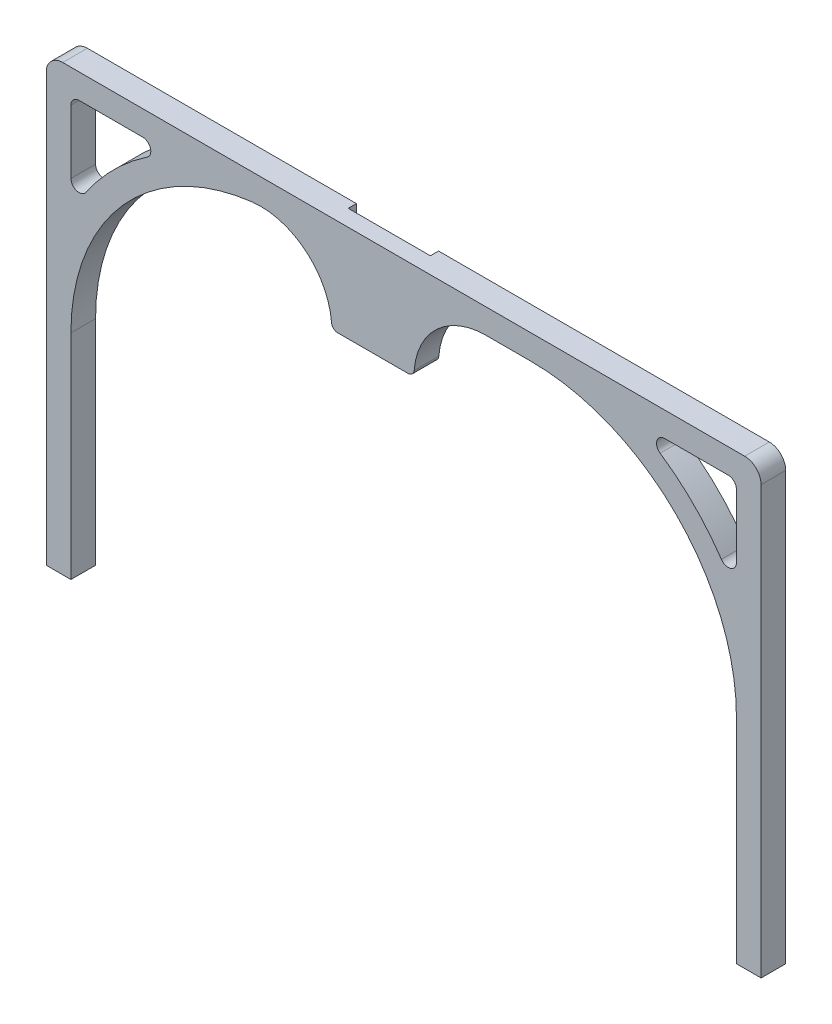
ISO-10303-21;
HEADER;
FILE_DESCRIPTION(('STEP AP214'),'2;1');
FILE_NAME('part.step','',(''),(''),'','','');
FILE_SCHEMA(('AUTOMOTIVE_DESIGN { 1 0 10303 214 1 1 1 1 }'));
ENDSEC;
DATA;
#1=APPLICATION_CONTEXT('core data for automotive mechanical design processes');
#2=APPLICATION_PROTOCOL_DEFINITION('international standard','automotive_design',2000,#1);
#3=PRODUCT_CONTEXT('',#1,'mechanical');
#4=PRODUCT('Part','Part','',(#3));
#5=PRODUCT_RELATED_PRODUCT_CATEGORY('part','',(#4));
#6=PRODUCT_DEFINITION_FORMATION('','',#4);
#7=PRODUCT_DEFINITION_CONTEXT('part definition',#1,'design');
#8=PRODUCT_DEFINITION('design','',#6,#7);
#9=PRODUCT_DEFINITION_SHAPE('','',#8);
#10=(LENGTH_UNIT() NAMED_UNIT(*) SI_UNIT(.MILLI.,.METRE.));
#11=(NAMED_UNIT(*) PLANE_ANGLE_UNIT() SI_UNIT($,.RADIAN.));
#12=(NAMED_UNIT(*) SI_UNIT($,.STERADIAN.) SOLID_ANGLE_UNIT());
#13=UNCERTAINTY_MEASURE_WITH_UNIT(LENGTH_MEASURE(1.E-05),#10,'distance_accuracy_value','');
#14=(GEOMETRIC_REPRESENTATION_CONTEXT(3) GLOBAL_UNCERTAINTY_ASSIGNED_CONTEXT((#13)) GLOBAL_UNIT_ASSIGNED_CONTEXT((#10,
#11,#12)) REPRESENTATION_CONTEXT('',''));
#15=CARTESIAN_POINT('',(0.,0.,0.));
#16=DIRECTION('',(0.,0.,1.));
#17=DIRECTION('',(1.,0.,0.));
#18=AXIS2_PLACEMENT_3D('',#15,#16,#17);
#19=CARTESIAN_POINT('',(-98.425,165.1,19.05));
#20=DIRECTION('',(0.,0.,1.));
#21=DIRECTION('',(-1.,0.,0.));
#22=AXIS2_PLACEMENT_3D('',#19,#20,#21);
#23=CYLINDRICAL_SURFACE('',#22,158.75);
#24=DIRECTION('',(0.,0.,1.));
#25=VECTOR('',#24,1.);
#26=CARTESIAN_POINT('',(-116.873274525354,322.774422995733,-169.772879774976));
#27=LINE('',#26,#25);
#28=CARTESIAN_POINT('',(-116.873274525354,322.774422995733,19.05));
#29=VERTEX_POINT('',#28);
#30=CARTESIAN_POINT('',(-116.873274525354,322.774422995733,38.1));
#31=VERTEX_POINT('',#30);
#32=EDGE_CURVE('E502',#29,#31,#27,.T.);
#33=ORIENTED_EDGE('',*,*,#32,.T.);
#34=CARTESIAN_POINT('',(-98.425,165.1,38.1));
#35=DIRECTION('',(0.,0.,-1.));
#36=DIRECTION('',(1.,0.,0.));
#37=AXIS2_PLACEMENT_3D('',#34,#35,#36);
#38=CIRCLE('',#37,158.75);
#39=CARTESIAN_POINT('',(-257.175,165.1,38.1));
#40=VERTEX_POINT('',#39);
#41=EDGE_CURVE('E441',#40,#31,#38,.T.);
#42=ORIENTED_EDGE('',*,*,#41,.F.);
#43=DIRECTION('',(0.,0.,1.));
#44=VECTOR('',#43,1.);
#45=CARTESIAN_POINT('',(-257.175,165.1,19.05));
#46=LINE('',#45,#44);
#47=CARTESIAN_POINT('',(-257.175,165.1,19.05));
#48=VERTEX_POINT('',#47);
#49=EDGE_CURVE('E457',#48,#40,#46,.T.);
#50=ORIENTED_EDGE('',*,*,#49,.F.);
#51=CARTESIAN_POINT('',(-98.425,165.1,19.05));
#52=DIRECTION('',(0.,0.,-1.));
#53=DIRECTION('',(1.,0.,0.));
#54=AXIS2_PLACEMENT_3D('',#51,#52,#53);
#55=CIRCLE('',#54,158.75);
#56=EDGE_CURVE('E406',#48,#29,#55,.T.);
#57=ORIENTED_EDGE('',*,*,#56,.T.);
#58=EDGE_LOOP('',(#33,#42,#50,#57));
#59=FACE_BOUND('',#58,.T.);
#60=ADVANCED_FACE('F37',(#59),#23,.F.);
#61=CARTESIAN_POINT('',(98.425,165.1,19.05));
#62=DIRECTION('',(0.,0.,1.));
#63=DIRECTION('',(-1.,0.,0.));
#64=AXIS2_PLACEMENT_3D('',#61,#62,#63);
#65=PLANE('',#64);
#66=CARTESIAN_POINT('',(-110.490153680438,268.21892,19.05));
#67=DIRECTION('',(0.,0.,-1.));
#68=DIRECTION('',(-1.,0.,0.));
#69=AXIS2_PLACEMENT_3D('',#66,#67,#68);
#70=CIRCLE('',#69,54.9276536804384);
#71=CARTESIAN_POINT('',(-55.7376130320166,272.6014342762,19.05));
#72=VERTEX_POINT('',#71);
#73=EDGE_CURVE('E497',#29,#72,#70,.T.);
#74=ORIENTED_EDGE('',*,*,#73,.F.);
#75=ORIENTED_EDGE('',*,*,#56,.F.);
#76=DIRECTION('',(0.,1.,0.));
#77=VECTOR('',#76,1.);
#78=CARTESIAN_POINT('',(-257.175,0.,19.05));
#79=LINE('',#78,#77);
#80=CARTESIAN_POINT('',(-257.175,0.,19.05));
#81=VERTEX_POINT('',#80);
#82=EDGE_CURVE('E404',#81,#48,#79,.T.);
#83=ORIENTED_EDGE('',*,*,#82,.F.);
#84=DIRECTION('',(1.,0.,0.));
#85=VECTOR('',#84,1.);
#86=CARTESIAN_POINT('',(-276.225,0.,19.05));
#87=LINE('',#86,#85);
#88=CARTESIAN_POINT('',(-276.225,0.,19.05));
#89=VERTEX_POINT('',#88);
#90=EDGE_CURVE('E401',#89,#81,#87,.T.);
#91=ORIENTED_EDGE('',*,*,#90,.F.);
#92=DIRECTION('',(0.,-1.,0.));
#93=VECTOR('',#92,1.);
#94=CARTESIAN_POINT('',(-276.225,0.,19.05));
#95=LINE('',#94,#93);
#96=CARTESIAN_POINT('',(-276.225,330.2,19.05));
#97=VERTEX_POINT('',#96);
#98=EDGE_CURVE('E398',#97,#89,#95,.T.);
#99=ORIENTED_EDGE('',*,*,#98,.F.);
#100=CARTESIAN_POINT('',(-263.525,330.2,19.05));
#101=DIRECTION('',(0.,0.,1.));
#102=DIRECTION('',(1.,0.,0.));
#103=AXIS2_PLACEMENT_3D('',#100,#101,#102);
#104=CIRCLE('',#103,12.7);
#105=CARTESIAN_POINT('',(-263.525,342.9,19.05));
#106=VERTEX_POINT('',#105);
#107=EDGE_CURVE('E395',#106,#97,#104,.T.);
#108=ORIENTED_EDGE('',*,*,#107,.F.);
#109=DIRECTION('',(-1.,0.,0.));
#110=VECTOR('',#109,1.);
#111=CARTESIAN_POINT('',(263.525,342.9,19.05));
#112=LINE('',#111,#110);
#113=CARTESIAN_POINT('',(-55.5625,342.9,19.05));
#114=VERTEX_POINT('',#113);
#115=EDGE_CURVE('E391',#114,#106,#112,.T.);
#116=ORIENTED_EDGE('',*,*,#115,.F.);
#117=DIRECTION('',(0.,1.,0.));
#118=VECTOR('',#117,1.);
#119=CARTESIAN_POINT('',(-55.5625,0.,19.05));
#120=LINE('',#119,#118);
#121=CARTESIAN_POINT('',(-55.5625,323.85,19.05));
#122=VERTEX_POINT('',#121);
#123=EDGE_CURVE('E279',#122,#114,#120,.T.);
#124=ORIENTED_EDGE('',*,*,#123,.F.);
#125=DIRECTION('',(-1.,0.,0.));
#126=VECTOR('',#125,1.);
#127=CARTESIAN_POINT('',(0.,323.85,19.05));
#128=LINE('',#127,#126);
#129=CARTESIAN_POINT('',(7.93749999999997,323.85,19.0500000000001));
#130=VERTEX_POINT('',#129);
#131=EDGE_CURVE('E500',#130,#122,#128,.T.);
#132=ORIENTED_EDGE('',*,*,#131,.F.);
#133=DIRECTION('',(0.,1.,0.));
#134=VECTOR('',#133,1.);
#135=CARTESIAN_POINT('',(7.9375,0.,19.0500000000001));
#136=LINE('',#135,#134);
#137=CARTESIAN_POINT('',(7.93749999999996,342.9,19.0500000000001));
#138=VERTEX_POINT('',#137);
#139=EDGE_CURVE('E258',#130,#138,#136,.T.);
#140=ORIENTED_EDGE('',*,*,#139,.T.);
#141=CARTESIAN_POINT('',(263.525,342.9,19.05));
#142=VERTEX_POINT('',#141);
#143=EDGE_CURVE('E392',#142,#138,#112,.T.);
#144=ORIENTED_EDGE('',*,*,#143,.F.);
#145=CARTESIAN_POINT('',(263.525,330.2,19.05));
#146=DIRECTION('',(0.,0.,1.));
#147=DIRECTION('',(1.,0.,0.));
#148=AXIS2_PLACEMENT_3D('',#145,#146,#147);
#149=CIRCLE('',#148,12.7);
#150=CARTESIAN_POINT('',(276.225,330.2,19.05));
#151=VERTEX_POINT('',#150);
#152=EDGE_CURVE('E388',#151,#142,#149,.T.);
#153=ORIENTED_EDGE('',*,*,#152,.F.);
#154=DIRECTION('',(0.,1.,0.));
#155=VECTOR('',#154,1.);
#156=CARTESIAN_POINT('',(276.225,0.,19.05));
#157=LINE('',#156,#155);
#158=CARTESIAN_POINT('',(276.225,0.,19.05));
#159=VERTEX_POINT('',#158);
#160=EDGE_CURVE('E384',#159,#151,#157,.T.);
#161=ORIENTED_EDGE('',*,*,#160,.F.);
#162=DIRECTION('',(1.,0.,0.));
#163=VECTOR('',#162,1.);
#164=CARTESIAN_POINT('',(276.225,0.,19.05));
#165=LINE('',#164,#163);
#166=CARTESIAN_POINT('',(257.175,0.,19.05));
#167=VERTEX_POINT('',#166);
#168=EDGE_CURVE('E381',#167,#159,#165,.T.);
#169=ORIENTED_EDGE('',*,*,#168,.F.);
#170=DIRECTION('',(0.,-1.,0.));
#171=VECTOR('',#170,1.);
#172=CARTESIAN_POINT('',(257.175,165.1,19.05));
#173=LINE('',#172,#171);
#174=CARTESIAN_POINT('',(257.175,165.1,19.05));
#175=VERTEX_POINT('',#174);
#176=EDGE_CURVE('E415',#175,#167,#173,.T.);
#177=ORIENTED_EDGE('',*,*,#176,.F.);
#178=CARTESIAN_POINT('',(98.425,165.1,19.05));
#179=DIRECTION('',(0.,0.,-1.));
#180=DIRECTION('',(-1.,0.,0.));
#181=AXIS2_PLACEMENT_3D('',#178,#179,#180);
#182=CIRCLE('',#181,158.75);
#183=CARTESIAN_POINT('',(98.4249999999999,323.85,19.05));
#184=VERTEX_POINT('',#183);
#185=EDGE_CURVE('E412',#184,#175,#182,.T.);
#186=ORIENTED_EDGE('',*,*,#185,.F.);
#187=DIRECTION('',(1.,0.,0.));
#188=VECTOR('',#187,1.);
#189=CARTESIAN_POINT('',(98.4249999999999,323.85,19.05));
#190=LINE('',#189,#188);
#191=CARTESIAN_POINT('',(63.56858,323.85,19.05));
#192=VERTEX_POINT('',#191);
#193=EDGE_CURVE('E409',#192,#184,#190,.T.);
#194=ORIENTED_EDGE('',*,*,#193,.F.);
#195=CARTESIAN_POINT('',(63.56858,268.21892,19.05));
#196=DIRECTION('',(0.,0.,-1.));
#197=DIRECTION('',(-1.,0.,0.));
#198=AXIS2_PLACEMENT_3D('',#195,#196,#197);
#199=CIRCLE('',#198,55.63108);
#200=CARTESIAN_POINT('',(8.11074179442255,272.605860110191,19.05));
#201=VERTEX_POINT('',#200);
#202=EDGE_CURVE('E498',#192,#201,#199,.F.);
#203=ORIENTED_EDGE('',*,*,#202,.T.);
#204=CARTESIAN_POINT('',(3.36307278540703,272.98142,19.05));
#205=DIRECTION('',(0.,0.,-1.));
#206=DIRECTION('',(-1.,0.,0.));
#207=AXIS2_PLACEMENT_3D('',#204,#205,#206);
#208=CIRCLE('',#207,4.7625);
#209=CARTESIAN_POINT('',(3.36307278540703,268.21892,19.05));
#210=VERTEX_POINT('',#209);
#211=EDGE_CURVE('E484',#210,#201,#208,.F.);
#212=ORIENTED_EDGE('',*,*,#211,.F.);
#213=DIRECTION('',(-1.,0.,0.));
#214=VECTOR('',#213,1.);
#215=CARTESIAN_POINT('',(0.,268.21892,19.05));
#216=LINE('',#215,#214);
#217=CARTESIAN_POINT('',(-50.9902962004045,268.21892,19.05));
#218=VERTEX_POINT('',#217);
#219=EDGE_CURVE('E492',#210,#218,#216,.T.);
#220=ORIENTED_EDGE('',*,*,#219,.T.);
#221=CARTESIAN_POINT('',(-50.9902962004045,272.98142,19.05));
#222=DIRECTION('',(0.,0.,-1.));
#223=DIRECTION('',(-1.,0.,0.));
#224=AXIS2_PLACEMENT_3D('',#221,#222,#223);
#225=CIRCLE('',#224,4.7625);
#226=EDGE_CURVE('E45',#72,#218,#225,.F.);
#227=ORIENTED_EDGE('',*,*,#226,.F.);
#228=EDGE_LOOP('',(#74,#75,#83,#91,#99,#108,#116,#124,#132,#140,#144,#153,#161,#169,#177,#186,
#194,#203,#212,#220,#227));
#229=FACE_BOUND('',#228,.T.);
#230=CARTESIAN_POINT('',(250.825,268.470510785233,19.05));
#231=DIRECTION('',(0.,0.,1.));
#232=DIRECTION('',(1.,0.,0.));
#233=AXIS2_PLACEMENT_3D('',#230,#231,#232);
#234=CIRCLE('',#233,6.35);
#235=CARTESIAN_POINT('',(245.569827586207,264.906010413329,19.05));
#236=VERTEX_POINT('',#235);
#237=CARTESIAN_POINT('',(257.175,268.470510785233,19.05));
#238=VERTEX_POINT('',#237);
#239=EDGE_CURVE('E333',#236,#238,#234,.T.);
#240=ORIENTED_EDGE('',*,*,#239,.T.);
#241=DIRECTION('',(0.,1.,0.));
#242=VECTOR('',#241,1.);
#243=CARTESIAN_POINT('',(257.175,317.5,19.05));
#244=LINE('',#243,#242);
#245=CARTESIAN_POINT('',(257.175,317.5,19.05));
#246=VERTEX_POINT('',#245);
#247=EDGE_CURVE('E336',#238,#246,#244,.T.);
#248=ORIENTED_EDGE('',*,*,#247,.T.);
#249=CARTESIAN_POINT('',(250.825,317.5,19.05));
#250=DIRECTION('',(0.,0.,1.));
#251=DIRECTION('',(1.,0.,0.));
#252=AXIS2_PLACEMENT_3D('',#249,#250,#251);
#253=CIRCLE('',#252,6.35000000000002);
#254=CARTESIAN_POINT('',(250.825,323.85,19.05));
#255=VERTEX_POINT('',#254);
#256=EDGE_CURVE('E340',#246,#255,#253,.T.);
#257=ORIENTED_EDGE('',*,*,#256,.T.);
#258=DIRECTION('',(-1.,0.,0.));
#259=VECTOR('',#258,1.);
#260=CARTESIAN_POINT('',(250.825,323.85,19.05));
#261=LINE('',#260,#259);
#262=CARTESIAN_POINT('',(201.795510785233,323.85,19.05));
#263=VERTEX_POINT('',#262);
#264=EDGE_CURVE('E343',#255,#263,#261,.T.);
#265=ORIENTED_EDGE('',*,*,#264,.T.);
#266=CARTESIAN_POINT('',(201.795510785233,317.5,19.05));
#267=DIRECTION('',(0.,0.,1.));
#268=DIRECTION('',(-1.,0.,0.));
#269=AXIS2_PLACEMENT_3D('',#266,#267,#268);
#270=CIRCLE('',#269,6.35);
#271=CARTESIAN_POINT('',(198.231010413329,312.244827586207,19.05));
#272=VERTEX_POINT('',#271);
#273=EDGE_CURVE('E346',#263,#272,#270,.T.);
#274=ORIENTED_EDGE('',*,*,#273,.T.);
#275=CARTESIAN_POINT('',(98.425,165.1,19.05));
#276=DIRECTION('',(0.,0.,-1.));
#277=DIRECTION('',(-1.,0.,0.));
#278=AXIS2_PLACEMENT_3D('',#275,#276,#277);
#279=CIRCLE('',#278,177.8);
#280=EDGE_CURVE('E349',#272,#236,#279,.T.);
#281=ORIENTED_EDGE('',*,*,#280,.T.);
#282=EDGE_LOOP('',(#240,#248,#257,#265,#274,#281));
#283=FACE_BOUND('',#282,.T.);
#284=CARTESIAN_POINT('',(-98.425,165.1,19.05));
#285=DIRECTION('',(0.,0.,-1.));
#286=DIRECTION('',(1.,0.,0.));
#287=AXIS2_PLACEMENT_3D('',#284,#285,#286);
#288=CIRCLE('',#287,177.8);
#289=CARTESIAN_POINT('',(-245.569827586207,264.906010413329,19.05));
#290=VERTEX_POINT('',#289);
#291=CARTESIAN_POINT('',(-198.231010413329,312.244827586207,19.05));
#292=VERTEX_POINT('',#291);
#293=EDGE_CURVE('E285',#290,#292,#288,.T.);
#294=ORIENTED_EDGE('',*,*,#293,.T.);
#295=CARTESIAN_POINT('',(-201.795510785233,317.5,19.05));
#296=DIRECTION('',(0.,0.,1.));
#297=DIRECTION('',(1.,0.,0.));
#298=AXIS2_PLACEMENT_3D('',#295,#296,#297);
#299=CIRCLE('',#298,6.35);
#300=CARTESIAN_POINT('',(-201.795510785233,323.85,19.05));
#301=VERTEX_POINT('',#300);
#302=EDGE_CURVE('E288',#292,#301,#299,.T.);
#303=ORIENTED_EDGE('',*,*,#302,.T.);
#304=DIRECTION('',(-1.,0.,0.));
#305=VECTOR('',#304,1.);
#306=CARTESIAN_POINT('',(-250.825,323.85,19.05));
#307=LINE('',#306,#305);
#308=CARTESIAN_POINT('',(-250.825,323.85,19.05));
#309=VERTEX_POINT('',#308);
#310=EDGE_CURVE('E292',#301,#309,#307,.T.);
#311=ORIENTED_EDGE('',*,*,#310,.T.);
#312=CARTESIAN_POINT('',(-250.825,317.5,19.05));
#313=DIRECTION('',(0.,0.,1.));
#314=DIRECTION('',(-1.,0.,0.));
#315=AXIS2_PLACEMENT_3D('',#312,#313,#314);
#316=CIRCLE('',#315,6.35000000000002);
#317=CARTESIAN_POINT('',(-257.175,317.5,19.05));
#318=VERTEX_POINT('',#317);
#319=EDGE_CURVE('E295',#309,#318,#316,.T.);
#320=ORIENTED_EDGE('',*,*,#319,.T.);
#321=DIRECTION('',(0.,-1.,0.));
#322=VECTOR('',#321,1.);
#323=CARTESIAN_POINT('',(-257.175,317.5,19.05));
#324=LINE('',#323,#322);
#325=CARTESIAN_POINT('',(-257.175,268.470510785233,19.05));
#326=VERTEX_POINT('',#325);
#327=EDGE_CURVE('E298',#318,#326,#324,.T.);
#328=ORIENTED_EDGE('',*,*,#327,.T.);
#329=CARTESIAN_POINT('',(-250.825,268.470510785233,19.05));
#330=DIRECTION('',(0.,0.,1.));
#331=DIRECTION('',(-1.,0.,0.));
#332=AXIS2_PLACEMENT_3D('',#329,#330,#331);
#333=CIRCLE('',#332,6.35);
#334=EDGE_CURVE('E301',#326,#290,#333,.T.);
#335=ORIENTED_EDGE('',*,*,#334,.T.);
#336=EDGE_LOOP('',(#294,#303,#311,#320,#328,#335));
#337=FACE_BOUND('',#336,.T.);
#338=ADVANCED_FACE('F493',(#229,#283,#337),#65,.F.);
#339=CARTESIAN_POINT('',(98.425,165.1,38.1));
#340=DIRECTION('',(0.,0.,1.));
#341=DIRECTION('',(-1.,0.,0.));
#342=AXIS2_PLACEMENT_3D('',#339,#340,#341);
#343=PLANE('',#342);
#344=DIRECTION('',(1.,0.,0.));
#345=VECTOR('',#344,1.);
#346=CARTESIAN_POINT('',(0.,268.21892,38.1));
#347=LINE('',#346,#345);
#348=CARTESIAN_POINT('',(-50.9902962004045,268.21892,38.1));
#349=VERTEX_POINT('',#348);
#350=CARTESIAN_POINT('',(3.36307278540703,268.21892,38.1));
#351=VERTEX_POINT('',#350);
#352=EDGE_CURVE('E507',#349,#351,#347,.T.);
#353=ORIENTED_EDGE('',*,*,#352,.T.);
#354=CARTESIAN_POINT('',(3.36307278540703,272.98142,38.1));
#355=DIRECTION('',(0.,0.,-1.));
#356=DIRECTION('',(-1.,0.,0.));
#357=AXIS2_PLACEMENT_3D('',#354,#355,#356);
#358=CIRCLE('',#357,4.7625);
#359=CARTESIAN_POINT('',(8.11074179442255,272.605860110191,38.1));
#360=VERTEX_POINT('',#359);
#361=EDGE_CURVE('E478',#360,#351,#358,.T.);
#362=ORIENTED_EDGE('',*,*,#361,.F.);
#363=CARTESIAN_POINT('',(63.56858,268.21892,38.1));
#364=DIRECTION('',(0.,0.,1.));
#365=DIRECTION('',(1.,0.,0.));
#366=AXIS2_PLACEMENT_3D('',#363,#364,#365);
#367=CIRCLE('',#366,55.63108);
#368=CARTESIAN_POINT('',(63.56858,323.85,38.1));
#369=VERTEX_POINT('',#368);
#370=EDGE_CURVE('E510',#360,#369,#367,.F.);
#371=ORIENTED_EDGE('',*,*,#370,.T.);
#372=DIRECTION('',(1.,0.,0.));
#373=VECTOR('',#372,1.);
#374=CARTESIAN_POINT('',(98.4249999999999,323.85,38.1));
#375=LINE('',#374,#373);
#376=CARTESIAN_POINT('',(98.4249999999999,323.85,38.1));
#377=VERTEX_POINT('',#376);
#378=EDGE_CURVE('E444',#369,#377,#375,.T.);
#379=ORIENTED_EDGE('',*,*,#378,.T.);
#380=CARTESIAN_POINT('',(98.425,165.1,38.1));
#381=DIRECTION('',(0.,0.,-1.));
#382=DIRECTION('',(-1.,0.,0.));
#383=AXIS2_PLACEMENT_3D('',#380,#381,#382);
#384=CIRCLE('',#383,158.75);
#385=CARTESIAN_POINT('',(257.175,165.1,38.1));
#386=VERTEX_POINT('',#385);
#387=EDGE_CURVE('E447',#377,#386,#384,.T.);
#388=ORIENTED_EDGE('',*,*,#387,.T.);
#389=DIRECTION('',(0.,-1.,0.));
#390=VECTOR('',#389,1.);
#391=CARTESIAN_POINT('',(257.175,0.,38.1));
#392=LINE('',#391,#390);
#393=CARTESIAN_POINT('',(257.175,0.,38.1));
#394=VERTEX_POINT('',#393);
#395=EDGE_CURVE('E385',#386,#394,#392,.T.);
#396=ORIENTED_EDGE('',*,*,#395,.T.);
#397=DIRECTION('',(1.,0.,0.));
#398=VECTOR('',#397,1.);
#399=CARTESIAN_POINT('',(276.225,0.,38.1));
#400=LINE('',#399,#398);
#401=CARTESIAN_POINT('',(276.225,0.,38.1));
#402=VERTEX_POINT('',#401);
#403=EDGE_CURVE('E380',#394,#402,#400,.T.);
#404=ORIENTED_EDGE('',*,*,#403,.T.);
#405=DIRECTION('',(0.,1.,0.));
#406=VECTOR('',#405,1.);
#407=CARTESIAN_POINT('',(276.225,0.,38.1));
#408=LINE('',#407,#406);
#409=CARTESIAN_POINT('',(276.225,330.2,38.1));
#410=VERTEX_POINT('',#409);
#411=EDGE_CURVE('E421',#402,#410,#408,.T.);
#412=ORIENTED_EDGE('',*,*,#411,.T.);
#413=CARTESIAN_POINT('',(263.525,330.2,38.1));
#414=DIRECTION('',(0.,0.,1.));
#415=DIRECTION('',(1.,0.,0.));
#416=AXIS2_PLACEMENT_3D('',#413,#414,#415);
#417=CIRCLE('',#416,12.7);
#418=CARTESIAN_POINT('',(263.525,342.9,38.1));
#419=VERTEX_POINT('',#418);
#420=EDGE_CURVE('E424',#410,#419,#417,.T.);
#421=ORIENTED_EDGE('',*,*,#420,.T.);
#422=DIRECTION('',(-1.,0.,0.));
#423=VECTOR('',#422,1.);
#424=CARTESIAN_POINT('',(263.525,342.9,38.1));
#425=LINE('',#424,#423);
#426=CARTESIAN_POINT('',(-263.525,342.9,38.1));
#427=VERTEX_POINT('',#426);
#428=EDGE_CURVE('E427',#419,#427,#425,.T.);
#429=ORIENTED_EDGE('',*,*,#428,.T.);
#430=CARTESIAN_POINT('',(-263.525,330.2,38.1));
#431=DIRECTION('',(0.,0.,1.));
#432=DIRECTION('',(1.,0.,0.));
#433=AXIS2_PLACEMENT_3D('',#430,#431,#432);
#434=CIRCLE('',#433,12.7);
#435=CARTESIAN_POINT('',(-276.225,330.2,38.1));
#436=VERTEX_POINT('',#435);
#437=EDGE_CURVE('E430',#427,#436,#434,.T.);
#438=ORIENTED_EDGE('',*,*,#437,.T.);
#439=DIRECTION('',(0.,-1.,0.));
#440=VECTOR('',#439,1.);
#441=CARTESIAN_POINT('',(-276.225,0.,38.1));
#442=LINE('',#441,#440);
#443=CARTESIAN_POINT('',(-276.225,0.,38.1));
#444=VERTEX_POINT('',#443);
#445=EDGE_CURVE('E433',#436,#444,#442,.T.);
#446=ORIENTED_EDGE('',*,*,#445,.T.);
#447=DIRECTION('',(1.,0.,0.));
#448=VECTOR('',#447,1.);
#449=CARTESIAN_POINT('',(-276.225,0.,38.1));
#450=LINE('',#449,#448);
#451=CARTESIAN_POINT('',(-257.175,0.,38.1));
#452=VERTEX_POINT('',#451);
#453=EDGE_CURVE('E436',#444,#452,#450,.T.);
#454=ORIENTED_EDGE('',*,*,#453,.T.);
#455=DIRECTION('',(0.,1.,0.));
#456=VECTOR('',#455,1.);
#457=CARTESIAN_POINT('',(-257.175,165.1,38.1));
#458=LINE('',#457,#456);
#459=EDGE_CURVE('E439',#452,#40,#458,.T.);
#460=ORIENTED_EDGE('',*,*,#459,.T.);
#461=ORIENTED_EDGE('',*,*,#41,.T.);
#462=CARTESIAN_POINT('',(-110.490153680438,268.21892,38.1));
#463=DIRECTION('',(0.,0.,1.));
#464=DIRECTION('',(1.,0.,0.));
#465=AXIS2_PLACEMENT_3D('',#462,#463,#464);
#466=CIRCLE('',#465,54.9276536804384);
#467=CARTESIAN_POINT('',(-55.7376130320166,272.6014342762,38.1));
#468=VERTEX_POINT('',#467);
#469=EDGE_CURVE('E505',#468,#31,#466,.T.);
#470=ORIENTED_EDGE('',*,*,#469,.F.);
#471=CARTESIAN_POINT('',(-50.9902962004045,272.98142,38.1));
#472=DIRECTION('',(0.,0.,-1.));
#473=DIRECTION('',(-1.,0.,0.));
#474=AXIS2_PLACEMENT_3D('',#471,#472,#473);
#475=CIRCLE('',#474,4.7625);
#476=EDGE_CURVE('E481',#349,#468,#475,.T.);
#477=ORIENTED_EDGE('',*,*,#476,.F.);
#478=EDGE_LOOP('',(#353,#362,#371,#379,#388,#396,#404,#412,#421,#429,#438,#446,#454,#460,#461,
#470,#477));
#479=FACE_BOUND('',#478,.T.);
#480=CARTESIAN_POINT('',(98.425,165.1,38.1));
#481=DIRECTION('',(0.,0.,-1.));
#482=DIRECTION('',(-1.,0.,0.));
#483=AXIS2_PLACEMENT_3D('',#480,#481,#482);
#484=CIRCLE('',#483,177.8);
#485=CARTESIAN_POINT('',(198.231010413329,312.244827586207,38.1));
#486=VERTEX_POINT('',#485);
#487=CARTESIAN_POINT('',(245.569827586207,264.906010413329,38.1));
#488=VERTEX_POINT('',#487);
#489=EDGE_CURVE('E337',#486,#488,#484,.T.);
#490=ORIENTED_EDGE('',*,*,#489,.F.);
#491=CARTESIAN_POINT('',(201.795510785233,317.5,38.1));
#492=DIRECTION('',(0.,0.,1.));
#493=DIRECTION('',(-1.,0.,0.));
#494=AXIS2_PLACEMENT_3D('',#491,#492,#493);
#495=CIRCLE('',#494,6.35);
#496=CARTESIAN_POINT('',(201.795510785233,323.85,38.1));
#497=VERTEX_POINT('',#496);
#498=EDGE_CURVE('E364',#497,#486,#495,.T.);
#499=ORIENTED_EDGE('',*,*,#498,.F.);
#500=DIRECTION('',(-1.,0.,0.));
#501=VECTOR('',#500,1.);
#502=CARTESIAN_POINT('',(250.825,323.85,38.1));
#503=LINE('',#502,#501);
#504=CARTESIAN_POINT('',(250.825,323.85,38.1));
#505=VERTEX_POINT('',#504);
#506=EDGE_CURVE('E361',#505,#497,#503,.T.);
#507=ORIENTED_EDGE('',*,*,#506,.F.);
#508=CARTESIAN_POINT('',(250.825,317.5,38.1));
#509=DIRECTION('',(0.,0.,1.));
#510=DIRECTION('',(1.,0.,0.));
#511=AXIS2_PLACEMENT_3D('',#508,#509,#510);
#512=CIRCLE('',#511,6.35000000000002);
#513=CARTESIAN_POINT('',(257.175,317.5,38.1));
#514=VERTEX_POINT('',#513);
#515=EDGE_CURVE('E358',#514,#505,#512,.T.);
#516=ORIENTED_EDGE('',*,*,#515,.F.);
#517=DIRECTION('',(0.,1.,0.));
#518=VECTOR('',#517,1.);
#519=CARTESIAN_POINT('',(257.175,317.5,38.1));
#520=LINE('',#519,#518);
#521=CARTESIAN_POINT('',(257.175,268.470510785233,38.1));
#522=VERTEX_POINT('',#521);
#523=EDGE_CURVE('E355',#522,#514,#520,.T.);
#524=ORIENTED_EDGE('',*,*,#523,.F.);
#525=CARTESIAN_POINT('',(250.825,268.470510785233,38.1));
#526=DIRECTION('',(0.,0.,1.));
#527=DIRECTION('',(1.,0.,0.));
#528=AXIS2_PLACEMENT_3D('',#525,#526,#527);
#529=CIRCLE('',#528,6.35);
#530=EDGE_CURVE('E332',#488,#522,#529,.T.);
#531=ORIENTED_EDGE('',*,*,#530,.F.);
#532=EDGE_LOOP('',(#490,#499,#507,#516,#524,#531));
#533=FACE_BOUND('',#532,.T.);
#534=CARTESIAN_POINT('',(-250.825,268.470510785233,38.1));
#535=DIRECTION('',(0.,0.,1.));
#536=DIRECTION('',(-1.,0.,0.));
#537=AXIS2_PLACEMENT_3D('',#534,#535,#536);
#538=CIRCLE('',#537,6.35);
#539=CARTESIAN_POINT('',(-257.175,268.470510785233,38.1));
#540=VERTEX_POINT('',#539);
#541=CARTESIAN_POINT('',(-245.569827586207,264.906010413329,38.1));
#542=VERTEX_POINT('',#541);
#543=EDGE_CURVE('E289',#540,#542,#538,.T.);
#544=ORIENTED_EDGE('',*,*,#543,.F.);
#545=DIRECTION('',(0.,-1.,0.));
#546=VECTOR('',#545,1.);
#547=CARTESIAN_POINT('',(-257.175,317.5,38.1));
#548=LINE('',#547,#546);
#549=CARTESIAN_POINT('',(-257.175,317.5,38.1));
#550=VERTEX_POINT('',#549);
#551=EDGE_CURVE('E316',#550,#540,#548,.T.);
#552=ORIENTED_EDGE('',*,*,#551,.F.);
#553=CARTESIAN_POINT('',(-250.825,317.5,38.1));
#554=DIRECTION('',(0.,0.,1.));
#555=DIRECTION('',(-1.,0.,0.));
#556=AXIS2_PLACEMENT_3D('',#553,#554,#555);
#557=CIRCLE('',#556,6.35000000000002);
#558=CARTESIAN_POINT('',(-250.825,323.85,38.1));
#559=VERTEX_POINT('',#558);
#560=EDGE_CURVE('E313',#559,#550,#557,.T.);
#561=ORIENTED_EDGE('',*,*,#560,.F.);
#562=DIRECTION('',(-1.,0.,0.));
#563=VECTOR('',#562,1.);
#564=CARTESIAN_POINT('',(-250.825,323.85,38.1));
#565=LINE('',#564,#563);
#566=CARTESIAN_POINT('',(-201.795510785233,323.85,38.1));
#567=VERTEX_POINT('',#566);
#568=EDGE_CURVE('E310',#567,#559,#565,.T.);
#569=ORIENTED_EDGE('',*,*,#568,.F.);
#570=CARTESIAN_POINT('',(-201.795510785233,317.5,38.1));
#571=DIRECTION('',(0.,0.,1.));
#572=DIRECTION('',(1.,0.,0.));
#573=AXIS2_PLACEMENT_3D('',#570,#571,#572);
#574=CIRCLE('',#573,6.35);
#575=CARTESIAN_POINT('',(-198.231010413329,312.244827586207,38.1));
#576=VERTEX_POINT('',#575);
#577=EDGE_CURVE('E307',#576,#567,#574,.T.);
#578=ORIENTED_EDGE('',*,*,#577,.F.);
#579=CARTESIAN_POINT('',(-98.425,165.1,38.1));
#580=DIRECTION('',(0.,0.,-1.));
#581=DIRECTION('',(1.,0.,0.));
#582=AXIS2_PLACEMENT_3D('',#579,#580,#581);
#583=CIRCLE('',#582,177.8);
#584=EDGE_CURVE('E277',#542,#576,#583,.T.);
#585=ORIENTED_EDGE('',*,*,#584,.F.);
#586=EDGE_LOOP('',(#544,#552,#561,#569,#578,#585));
#587=FACE_BOUND('',#586,.T.);
#588=ADVANCED_FACE('F553',(#479,#533,#587),#343,.T.);
#589=CARTESIAN_POINT('',(276.225,0.,19.05));
#590=DIRECTION('',(0.,1.,0.));
#591=DIRECTION('',(-1.,0.,0.));
#592=AXIS2_PLACEMENT_3D('',#589,#590,#591);
#593=PLANE('',#592);
#594=ORIENTED_EDGE('',*,*,#403,.F.);
#595=DIRECTION('',(0.,0.,1.));
#596=VECTOR('',#595,1.);
#597=CARTESIAN_POINT('',(257.175,0.,19.05));
#598=LINE('',#597,#596);
#599=EDGE_CURVE('E418',#167,#394,#598,.T.);
#600=ORIENTED_EDGE('',*,*,#599,.F.);
#601=ORIENTED_EDGE('',*,*,#168,.T.);
#602=DIRECTION('',(0.,0.,1.));
#603=VECTOR('',#602,1.);
#604=CARTESIAN_POINT('',(276.225,0.,19.05));
#605=LINE('',#604,#603);
#606=EDGE_CURVE('E263',#159,#402,#605,.T.);
#607=ORIENTED_EDGE('',*,*,#606,.T.);
#608=EDGE_LOOP('',(#594,#600,#601,#607));
#609=FACE_BOUND('',#608,.T.);
#610=ADVANCED_FACE('F584',(#609),#593,.F.);
#611=CARTESIAN_POINT('',(276.225,0.,19.05));
#612=DIRECTION('',(-1.,0.,0.));
#613=DIRECTION('',(0.,0.,-1.));
#614=AXIS2_PLACEMENT_3D('',#611,#612,#613);
#615=PLANE('',#614);
#616=ORIENTED_EDGE('',*,*,#411,.F.);
#617=ORIENTED_EDGE('',*,*,#606,.F.);
#618=ORIENTED_EDGE('',*,*,#160,.T.);
#619=DIRECTION('',(0.,0.,1.));
#620=VECTOR('',#619,1.);
#621=CARTESIAN_POINT('',(276.225,330.2,19.05));
#622=LINE('',#621,#620);
#623=EDGE_CURVE('E470',#151,#410,#622,.T.);
#624=ORIENTED_EDGE('',*,*,#623,.T.);
#625=EDGE_LOOP('',(#616,#617,#618,#624));
#626=FACE_BOUND('',#625,.T.);
#627=ADVANCED_FACE('F580',(#626),#615,.F.);
#628=CARTESIAN_POINT('',(263.525,330.2,19.05));
#629=DIRECTION('',(0.,0.,1.));
#630=DIRECTION('',(-1.,0.,0.));
#631=AXIS2_PLACEMENT_3D('',#628,#629,#630);
#632=CYLINDRICAL_SURFACE('',#631,12.7);
#633=ORIENTED_EDGE('',*,*,#420,.F.);
#634=ORIENTED_EDGE('',*,*,#623,.F.);
#635=ORIENTED_EDGE('',*,*,#152,.T.);
#636=DIRECTION('',(0.,0.,1.));
#637=VECTOR('',#636,1.);
#638=CARTESIAN_POINT('',(263.525,342.9,19.05));
#639=LINE('',#638,#637);
#640=EDGE_CURVE('E468',#142,#419,#639,.T.);
#641=ORIENTED_EDGE('',*,*,#640,.T.);
#642=EDGE_LOOP('',(#633,#634,#635,#641));
#643=FACE_BOUND('',#642,.T.);
#644=ADVANCED_FACE('F577',(#643),#632,.T.);
#645=CARTESIAN_POINT('',(263.525,342.9,19.05));
#646=DIRECTION('',(0.,-1.,0.));
#647=DIRECTION('',(1.,0.,0.));
#648=AXIS2_PLACEMENT_3D('',#645,#646,#647);
#649=PLANE('',#648);
#650=ORIENTED_EDGE('',*,*,#115,.T.);
#651=DIRECTION('',(0.,0.,1.));
#652=VECTOR('',#651,1.);
#653=CARTESIAN_POINT('',(-263.525,342.9,19.05));
#654=LINE('',#653,#652);
#655=EDGE_CURVE('E466',#106,#427,#654,.T.);
#656=ORIENTED_EDGE('',*,*,#655,.T.);
#657=ORIENTED_EDGE('',*,*,#428,.F.);
#658=ORIENTED_EDGE('',*,*,#640,.F.);
#659=ORIENTED_EDGE('',*,*,#143,.T.);
#660=DIRECTION('',(0.,0.,1.));
#661=VECTOR('',#660,1.);
#662=CARTESIAN_POINT('',(7.93749999999996,342.9,19.0500000000001));
#663=LINE('',#662,#661);
#664=CARTESIAN_POINT('',(7.93749999999996,342.9,25.4000000000001));
#665=VERTEX_POINT('',#664);
#666=EDGE_CURVE('E520',#138,#665,#663,.T.);
#667=ORIENTED_EDGE('',*,*,#666,.T.);
#668=DIRECTION('',(-1.,0.,0.));
#669=VECTOR('',#668,1.);
#670=CARTESIAN_POINT('',(-55.5625,342.9,25.4));
#671=LINE('',#670,#669);
#672=CARTESIAN_POINT('',(-55.5625,342.9,25.4));
#673=VERTEX_POINT('',#672);
#674=EDGE_CURVE('E273',#665,#673,#671,.T.);
#675=ORIENTED_EDGE('',*,*,#674,.T.);
#676=DIRECTION('',(0.,0.,-1.));
#677=VECTOR('',#676,1.);
#678=CARTESIAN_POINT('',(-55.5625,342.9,19.05));
#679=LINE('',#678,#677);
#680=EDGE_CURVE('E518',#673,#114,#679,.T.);
#681=ORIENTED_EDGE('',*,*,#680,.T.);
#682=EDGE_LOOP('',(#650,#656,#657,#658,#659,#667,#675,#681));
#683=FACE_BOUND('',#682,.T.);
#684=ADVANCED_FACE('F523',(#683),#649,.F.);
#685=CARTESIAN_POINT('',(-263.525,330.2,19.05));
#686=DIRECTION('',(0.,0.,1.));
#687=DIRECTION('',(-1.,0.,0.));
#688=AXIS2_PLACEMENT_3D('',#685,#686,#687);
#689=CYLINDRICAL_SURFACE('',#688,12.7);
#690=ORIENTED_EDGE('',*,*,#437,.F.);
#691=ORIENTED_EDGE('',*,*,#655,.F.);
#692=ORIENTED_EDGE('',*,*,#107,.T.);
#693=DIRECTION('',(0.,0.,1.));
#694=VECTOR('',#693,1.);
#695=CARTESIAN_POINT('',(-276.225,330.2,19.05));
#696=LINE('',#695,#694);
#697=EDGE_CURVE('E464',#97,#436,#696,.T.);
#698=ORIENTED_EDGE('',*,*,#697,.T.);
#699=EDGE_LOOP('',(#690,#691,#692,#698));
#700=FACE_BOUND('',#699,.T.);
#701=ADVANCED_FACE('F570',(#700),#689,.T.);
#702=CARTESIAN_POINT('',(-276.225,0.,19.05));
#703=DIRECTION('',(1.,0.,0.));
#704=DIRECTION('',(0.,1.,0.));
#705=AXIS2_PLACEMENT_3D('',#702,#703,#704);
#706=PLANE('',#705);
#707=ORIENTED_EDGE('',*,*,#445,.F.);
#708=ORIENTED_EDGE('',*,*,#697,.F.);
#709=ORIENTED_EDGE('',*,*,#98,.T.);
#710=DIRECTION('',(0.,0.,1.));
#711=VECTOR('',#710,1.);
#712=CARTESIAN_POINT('',(-276.225,0.,19.05));
#713=LINE('',#712,#711);
#714=EDGE_CURVE('E462',#89,#444,#713,.T.);
#715=ORIENTED_EDGE('',*,*,#714,.T.);
#716=EDGE_LOOP('',(#707,#708,#709,#715));
#717=FACE_BOUND('',#716,.T.);
#718=ADVANCED_FACE('F566',(#717),#706,.F.);
#719=CARTESIAN_POINT('',(-276.225,0.,19.05));
#720=DIRECTION('',(0.,1.,0.));
#721=DIRECTION('',(-1.,0.,0.));
#722=AXIS2_PLACEMENT_3D('',#719,#720,#721);
#723=PLANE('',#722);
#724=ORIENTED_EDGE('',*,*,#453,.F.);
#725=ORIENTED_EDGE('',*,*,#714,.F.);
#726=ORIENTED_EDGE('',*,*,#90,.T.);
#727=DIRECTION('',(0.,0.,1.));
#728=VECTOR('',#727,1.);
#729=CARTESIAN_POINT('',(-257.175,0.,19.05));
#730=LINE('',#729,#728);
#731=EDGE_CURVE('E460',#81,#452,#730,.T.);
#732=ORIENTED_EDGE('',*,*,#731,.T.);
#733=EDGE_LOOP('',(#724,#725,#726,#732));
#734=FACE_BOUND('',#733,.T.);
#735=ADVANCED_FACE('F562',(#734),#723,.F.);
#736=CARTESIAN_POINT('',(-257.175,165.1,19.05));
#737=DIRECTION('',(-1.,0.,0.));
#738=DIRECTION('',(0.,-1.,0.));
#739=AXIS2_PLACEMENT_3D('',#736,#737,#738);
#740=PLANE('',#739);
#741=ORIENTED_EDGE('',*,*,#459,.F.);
#742=ORIENTED_EDGE('',*,*,#731,.F.);
#743=ORIENTED_EDGE('',*,*,#82,.T.);
#744=ORIENTED_EDGE('',*,*,#49,.T.);
#745=EDGE_LOOP('',(#741,#742,#743,#744));
#746=FACE_BOUND('',#745,.T.);
#747=ADVANCED_FACE('F559',(#746),#740,.F.);
#748=CARTESIAN_POINT('',(98.4249999999999,323.85,19.05));
#749=DIRECTION('',(0.,1.,0.));
#750=DIRECTION('',(0.,0.,-1.));
#751=AXIS2_PLACEMENT_3D('',#748,#749,#750);
#752=PLANE('',#751);
#753=ORIENTED_EDGE('',*,*,#193,.T.);
#754=DIRECTION('',(0.,0.,1.));
#755=VECTOR('',#754,1.);
#756=CARTESIAN_POINT('',(98.4249999999999,323.85,19.05));
#757=LINE('',#756,#755);
#758=EDGE_CURVE('E455',#184,#377,#757,.T.);
#759=ORIENTED_EDGE('',*,*,#758,.T.);
#760=ORIENTED_EDGE('',*,*,#378,.F.);
#761=DIRECTION('',(0.,0.,1.));
#762=VECTOR('',#761,1.);
#763=CARTESIAN_POINT('',(63.56858,323.85,-169.772879774976));
#764=LINE('',#763,#762);
#765=EDGE_CURVE('E513',#192,#369,#764,.T.);
#766=ORIENTED_EDGE('',*,*,#765,.F.);
#767=EDGE_LOOP('',(#753,#759,#760,#766));
#768=FACE_BOUND('',#767,.T.);
#769=ADVANCED_FACE('F557',(#768),#752,.F.);
#770=CARTESIAN_POINT('',(98.425,165.1,19.05));
#771=DIRECTION('',(0.,0.,1.));
#772=DIRECTION('',(-1.,0.,0.));
#773=AXIS2_PLACEMENT_3D('',#770,#771,#772);
#774=CYLINDRICAL_SURFACE('',#773,158.75);
#775=ORIENTED_EDGE('',*,*,#387,.F.);
#776=ORIENTED_EDGE('',*,*,#758,.F.);
#777=ORIENTED_EDGE('',*,*,#185,.T.);
#778=DIRECTION('',(0.,0.,1.));
#779=VECTOR('',#778,1.);
#780=CARTESIAN_POINT('',(257.175,165.1,19.05));
#781=LINE('',#780,#779);
#782=EDGE_CURVE('E453',#175,#386,#781,.T.);
#783=ORIENTED_EDGE('',*,*,#782,.T.);
#784=EDGE_LOOP('',(#775,#776,#777,#783));
#785=FACE_BOUND('',#784,.T.);
#786=ADVANCED_FACE('F784',(#785),#774,.F.);
#787=CARTESIAN_POINT('',(257.175,0.,19.05));
#788=DIRECTION('',(1.,0.,0.));
#789=DIRECTION('',(0.,0.,1.));
#790=AXIS2_PLACEMENT_3D('',#787,#788,#789);
#791=PLANE('',#790);
#792=ORIENTED_EDGE('',*,*,#395,.F.);
#793=ORIENTED_EDGE('',*,*,#782,.F.);
#794=ORIENTED_EDGE('',*,*,#176,.T.);
#795=ORIENTED_EDGE('',*,*,#599,.T.);
#796=EDGE_LOOP('',(#792,#793,#794,#795));
#797=FACE_BOUND('',#796,.T.);
#798=ADVANCED_FACE('F774',(#797),#791,.F.);
#799=CARTESIAN_POINT('',(250.825,268.470510785233,19.05));
#800=DIRECTION('',(0.,0.,1.));
#801=DIRECTION('',(-1.,0.,0.));
#802=AXIS2_PLACEMENT_3D('',#799,#800,#801);
#803=CYLINDRICAL_SURFACE('',#802,6.35);
#804=ORIENTED_EDGE('',*,*,#530,.T.);
#805=DIRECTION('',(0.,0.,1.));
#806=VECTOR('',#805,1.);
#807=CARTESIAN_POINT('',(257.175,268.470510785233,19.05));
#808=LINE('',#807,#806);
#809=EDGE_CURVE('E378',#238,#522,#808,.T.);
#810=ORIENTED_EDGE('',*,*,#809,.F.);
#811=ORIENTED_EDGE('',*,*,#239,.F.);
#812=DIRECTION('',(0.,0.,1.));
#813=VECTOR('',#812,1.);
#814=CARTESIAN_POINT('',(245.569827586207,264.906010413329,19.05));
#815=LINE('',#814,#813);
#816=EDGE_CURVE('E352',#236,#488,#815,.T.);
#817=ORIENTED_EDGE('',*,*,#816,.T.);
#818=EDGE_LOOP('',(#804,#810,#811,#817));
#819=FACE_BOUND('',#818,.T.);
#820=ADVANCED_FACE('F764',(#819),#803,.F.);
#821=CARTESIAN_POINT('',(257.175,317.5,19.05));
#822=DIRECTION('',(-1.,0.,0.));
#823=DIRECTION('',(0.,0.,-1.));
#824=AXIS2_PLACEMENT_3D('',#821,#822,#823);
#825=PLANE('',#824);
#826=ORIENTED_EDGE('',*,*,#523,.T.);
#827=DIRECTION('',(0.,0.,1.));
#828=VECTOR('',#827,1.);
#829=CARTESIAN_POINT('',(257.175,317.5,19.05));
#830=LINE('',#829,#828);
#831=EDGE_CURVE('E376',#246,#514,#830,.T.);
#832=ORIENTED_EDGE('',*,*,#831,.F.);
#833=ORIENTED_EDGE('',*,*,#247,.F.);
#834=ORIENTED_EDGE('',*,*,#809,.T.);
#835=EDGE_LOOP('',(#826,#832,#833,#834));
#836=FACE_BOUND('',#835,.T.);
#837=ADVANCED_FACE('F754',(#836),#825,.T.);
#838=CARTESIAN_POINT('',(250.825,317.5,19.05));
#839=DIRECTION('',(0.,0.,1.));
#840=DIRECTION('',(-1.,0.,0.));
#841=AXIS2_PLACEMENT_3D('',#838,#839,#840);
#842=CYLINDRICAL_SURFACE('',#841,6.35000000000002);
#843=ORIENTED_EDGE('',*,*,#515,.T.);
#844=DIRECTION('',(0.,0.,1.));
#845=VECTOR('',#844,1.);
#846=CARTESIAN_POINT('',(250.825,323.85,19.05));
#847=LINE('',#846,#845);
#848=EDGE_CURVE('E374',#255,#505,#847,.T.);
#849=ORIENTED_EDGE('',*,*,#848,.F.);
#850=ORIENTED_EDGE('',*,*,#256,.F.);
#851=ORIENTED_EDGE('',*,*,#831,.T.);
#852=EDGE_LOOP('',(#843,#849,#850,#851));
#853=FACE_BOUND('',#852,.T.);
#854=ADVANCED_FACE('F744',(#853),#842,.F.);
#855=CARTESIAN_POINT('',(250.825,323.85,19.05));
#856=DIRECTION('',(0.,-1.,0.));
#857=DIRECTION('',(1.,0.,0.));
#858=AXIS2_PLACEMENT_3D('',#855,#856,#857);
#859=PLANE('',#858);
#860=ORIENTED_EDGE('',*,*,#506,.T.);
#861=DIRECTION('',(0.,0.,1.));
#862=VECTOR('',#861,1.);
#863=CARTESIAN_POINT('',(201.795510785233,323.85,19.05));
#864=LINE('',#863,#862);
#865=EDGE_CURVE('E372',#263,#497,#864,.T.);
#866=ORIENTED_EDGE('',*,*,#865,.F.);
#867=ORIENTED_EDGE('',*,*,#264,.F.);
#868=ORIENTED_EDGE('',*,*,#848,.T.);
#869=EDGE_LOOP('',(#860,#866,#867,#868));
#870=FACE_BOUND('',#869,.T.);
#871=ADVANCED_FACE('F734',(#870),#859,.T.);
#872=CARTESIAN_POINT('',(201.795510785233,317.5,19.05));
#873=DIRECTION('',(0.,0.,1.));
#874=DIRECTION('',(-1.,0.,0.));
#875=AXIS2_PLACEMENT_3D('',#872,#873,#874);
#876=CYLINDRICAL_SURFACE('',#875,6.35);
#877=ORIENTED_EDGE('',*,*,#498,.T.);
#878=DIRECTION('',(0.,0.,1.));
#879=VECTOR('',#878,1.);
#880=CARTESIAN_POINT('',(198.231010413329,312.244827586207,19.05));
#881=LINE('',#880,#879);
#882=EDGE_CURVE('E370',#272,#486,#881,.T.);
#883=ORIENTED_EDGE('',*,*,#882,.F.);
#884=ORIENTED_EDGE('',*,*,#273,.F.);
#885=ORIENTED_EDGE('',*,*,#865,.T.);
#886=EDGE_LOOP('',(#877,#883,#884,#885));
#887=FACE_BOUND('',#886,.T.);
#888=ADVANCED_FACE('F724',(#887),#876,.F.);
#889=CARTESIAN_POINT('',(98.425,165.1,19.05));
#890=DIRECTION('',(0.,0.,1.));
#891=DIRECTION('',(-1.,0.,0.));
#892=AXIS2_PLACEMENT_3D('',#889,#890,#891);
#893=CYLINDRICAL_SURFACE('',#892,177.8);
#894=ORIENTED_EDGE('',*,*,#489,.T.);
#895=ORIENTED_EDGE('',*,*,#816,.F.);
#896=ORIENTED_EDGE('',*,*,#280,.F.);
#897=ORIENTED_EDGE('',*,*,#882,.T.);
#898=EDGE_LOOP('',(#894,#895,#896,#897));
#899=FACE_BOUND('',#898,.T.);
#900=ADVANCED_FACE('F714',(#899),#893,.T.);
#901=CARTESIAN_POINT('',(-98.425,165.1,19.05));
#902=DIRECTION('',(0.,0.,1.));
#903=DIRECTION('',(-1.,0.,0.));
#904=AXIS2_PLACEMENT_3D('',#901,#902,#903);
#905=CYLINDRICAL_SURFACE('',#904,177.8);
#906=ORIENTED_EDGE('',*,*,#584,.T.);
#907=DIRECTION('',(0.,0.,1.));
#908=VECTOR('',#907,1.);
#909=CARTESIAN_POINT('',(-198.231010413329,312.244827586207,19.05));
#910=LINE('',#909,#908);
#911=EDGE_CURVE('E330',#292,#576,#910,.T.);
#912=ORIENTED_EDGE('',*,*,#911,.F.);
#913=ORIENTED_EDGE('',*,*,#293,.F.);
#914=DIRECTION('',(0.,0.,1.));
#915=VECTOR('',#914,1.);
#916=CARTESIAN_POINT('',(-245.569827586207,264.906010413329,19.05));
#917=LINE('',#916,#915);
#918=EDGE_CURVE('E304',#290,#542,#917,.T.);
#919=ORIENTED_EDGE('',*,*,#918,.T.);
#920=EDGE_LOOP('',(#906,#912,#913,#919));
#921=FACE_BOUND('',#920,.T.);
#922=ADVANCED_FACE('F704',(#921),#905,.T.);
#923=CARTESIAN_POINT('',(-201.795510785233,317.5,19.05));
#924=DIRECTION('',(0.,0.,1.));
#925=DIRECTION('',(-1.,0.,0.));
#926=AXIS2_PLACEMENT_3D('',#923,#924,#925);
#927=CYLINDRICAL_SURFACE('',#926,6.35);
#928=ORIENTED_EDGE('',*,*,#577,.T.);
#929=DIRECTION('',(0.,0.,1.));
#930=VECTOR('',#929,1.);
#931=CARTESIAN_POINT('',(-201.795510785233,323.85,19.05));
#932=LINE('',#931,#930);
#933=EDGE_CURVE('E328',#301,#567,#932,.T.);
#934=ORIENTED_EDGE('',*,*,#933,.F.);
#935=ORIENTED_EDGE('',*,*,#302,.F.);
#936=ORIENTED_EDGE('',*,*,#911,.T.);
#937=EDGE_LOOP('',(#928,#934,#935,#936));
#938=FACE_BOUND('',#937,.T.);
#939=ADVANCED_FACE('F694',(#938),#927,.F.);
#940=CARTESIAN_POINT('',(-250.825,323.85,19.05));
#941=DIRECTION('',(0.,-1.,0.));
#942=DIRECTION('',(1.,0.,0.));
#943=AXIS2_PLACEMENT_3D('',#940,#941,#942);
#944=PLANE('',#943);
#945=ORIENTED_EDGE('',*,*,#568,.T.);
#946=DIRECTION('',(0.,0.,1.));
#947=VECTOR('',#946,1.);
#948=CARTESIAN_POINT('',(-250.825,323.85,19.05));
#949=LINE('',#948,#947);
#950=EDGE_CURVE('E326',#309,#559,#949,.T.);
#951=ORIENTED_EDGE('',*,*,#950,.F.);
#952=ORIENTED_EDGE('',*,*,#310,.F.);
#953=ORIENTED_EDGE('',*,*,#933,.T.);
#954=EDGE_LOOP('',(#945,#951,#952,#953));
#955=FACE_BOUND('',#954,.T.);
#956=ADVANCED_FACE('F684',(#955),#944,.T.);
#957=CARTESIAN_POINT('',(-250.825,317.5,19.05));
#958=DIRECTION('',(0.,0.,1.));
#959=DIRECTION('',(-1.,0.,0.));
#960=AXIS2_PLACEMENT_3D('',#957,#958,#959);
#961=CYLINDRICAL_SURFACE('',#960,6.35000000000002);
#962=ORIENTED_EDGE('',*,*,#560,.T.);
#963=DIRECTION('',(0.,0.,1.));
#964=VECTOR('',#963,1.);
#965=CARTESIAN_POINT('',(-257.175,317.5,19.05));
#966=LINE('',#965,#964);
#967=EDGE_CURVE('E324',#318,#550,#966,.T.);
#968=ORIENTED_EDGE('',*,*,#967,.F.);
#969=ORIENTED_EDGE('',*,*,#319,.F.);
#970=ORIENTED_EDGE('',*,*,#950,.T.);
#971=EDGE_LOOP('',(#962,#968,#969,#970));
#972=FACE_BOUND('',#971,.T.);
#973=ADVANCED_FACE('F674',(#972),#961,.F.);
#974=CARTESIAN_POINT('',(-257.175,317.5,19.05));
#975=DIRECTION('',(1.,0.,0.));
#976=DIRECTION('',(0.,0.,1.));
#977=AXIS2_PLACEMENT_3D('',#974,#975,#976);
#978=PLANE('',#977);
#979=ORIENTED_EDGE('',*,*,#551,.T.);
#980=DIRECTION('',(0.,0.,1.));
#981=VECTOR('',#980,1.);
#982=CARTESIAN_POINT('',(-257.175,268.470510785233,19.05));
#983=LINE('',#982,#981);
#984=EDGE_CURVE('E322',#326,#540,#983,.T.);
#985=ORIENTED_EDGE('',*,*,#984,.F.);
#986=ORIENTED_EDGE('',*,*,#327,.F.);
#987=ORIENTED_EDGE('',*,*,#967,.T.);
#988=EDGE_LOOP('',(#979,#985,#986,#987));
#989=FACE_BOUND('',#988,.T.);
#990=ADVANCED_FACE('F542',(#989),#978,.T.);
#991=CARTESIAN_POINT('',(-250.825,268.470510785233,19.05));
#992=DIRECTION('',(0.,0.,1.));
#993=DIRECTION('',(-1.,0.,0.));
#994=AXIS2_PLACEMENT_3D('',#991,#992,#993);
#995=CYLINDRICAL_SURFACE('',#994,6.35);
#996=ORIENTED_EDGE('',*,*,#543,.T.);
#997=ORIENTED_EDGE('',*,*,#918,.F.);
#998=ORIENTED_EDGE('',*,*,#334,.F.);
#999=ORIENTED_EDGE('',*,*,#984,.T.);
#1000=EDGE_LOOP('',(#996,#997,#998,#999));
#1001=FACE_BOUND('',#1000,.T.);
#1002=ADVANCED_FACE('F534',(#1001),#995,.F.);
#1003=CARTESIAN_POINT('',(-55.5625,0.,19.05));
#1004=DIRECTION('',(-1.,0.,0.));
#1005=DIRECTION('',(0.,-1.,0.));
#1006=AXIS2_PLACEMENT_3D('',#1003,#1004,#1005);
#1007=PLANE('',#1006);
#1008=DIRECTION('',(0.,1.,0.));
#1009=VECTOR('',#1008,1.);
#1010=CARTESIAN_POINT('',(-55.5625,0.,25.4));
#1011=LINE('',#1010,#1009);
#1012=CARTESIAN_POINT('',(-55.5625,323.85,25.4));
#1013=VERTEX_POINT('',#1012);
#1014=EDGE_CURVE('E275',#1013,#673,#1011,.T.);
#1015=ORIENTED_EDGE('',*,*,#1014,.F.);
#1016=DIRECTION('',(0.,0.,-1.));
#1017=VECTOR('',#1016,1.);
#1018=CARTESIAN_POINT('',(-55.5625,323.85,19.05));
#1019=LINE('',#1018,#1017);
#1020=EDGE_CURVE('E267',#1013,#122,#1019,.T.);
#1021=ORIENTED_EDGE('',*,*,#1020,.T.);
#1022=ORIENTED_EDGE('',*,*,#123,.T.);
#1023=ORIENTED_EDGE('',*,*,#680,.F.);
#1024=EDGE_LOOP('',(#1015,#1021,#1022,#1023));
#1025=FACE_BOUND('',#1024,.T.);
#1026=ADVANCED_FACE('F532',(#1025),#1007,.F.);
#1027=CARTESIAN_POINT('',(-55.5625,0.,25.4));
#1028=DIRECTION('',(0.,0.,1.));
#1029=DIRECTION('',(-1.,0.,0.));
#1030=AXIS2_PLACEMENT_3D('',#1027,#1028,#1029);
#1031=PLANE('',#1030);
#1032=DIRECTION('',(0.,1.,0.));
#1033=VECTOR('',#1032,1.);
#1034=CARTESIAN_POINT('',(7.9375,0.,25.4000000000001));
#1035=LINE('',#1034,#1033);
#1036=CARTESIAN_POINT('',(7.93749999999997,323.85,25.4000000000001));
#1037=VERTEX_POINT('',#1036);
#1038=EDGE_CURVE('E255',#1037,#665,#1035,.T.);
#1039=ORIENTED_EDGE('',*,*,#1038,.F.);
#1040=DIRECTION('',(-1.,0.,0.));
#1041=VECTOR('',#1040,1.);
#1042=CARTESIAN_POINT('',(98.4249999999999,323.85,25.4000000000001));
#1043=LINE('',#1042,#1041);
#1044=EDGE_CURVE('E262',#1037,#1013,#1043,.T.);
#1045=ORIENTED_EDGE('',*,*,#1044,.T.);
#1046=ORIENTED_EDGE('',*,*,#1014,.T.);
#1047=ORIENTED_EDGE('',*,*,#674,.F.);
#1048=EDGE_LOOP('',(#1039,#1045,#1046,#1047));
#1049=FACE_BOUND('',#1048,.T.);
#1050=ADVANCED_FACE('F271',(#1049),#1031,.F.);
#1051=CARTESIAN_POINT('',(7.9375,0.,19.0500000000001));
#1052=DIRECTION('',(1.,0.,0.));
#1053=DIRECTION('',(0.,1.,0.));
#1054=AXIS2_PLACEMENT_3D('',#1051,#1052,#1053);
#1055=PLANE('',#1054);
#1056=ORIENTED_EDGE('',*,*,#139,.F.);
#1057=DIRECTION('',(0.,0.,1.));
#1058=VECTOR('',#1057,1.);
#1059=CARTESIAN_POINT('',(7.93749999999997,323.85,19.05));
#1060=LINE('',#1059,#1058);
#1061=EDGE_CURVE('E251',#130,#1037,#1060,.T.);
#1062=ORIENTED_EDGE('',*,*,#1061,.T.);
#1063=ORIENTED_EDGE('',*,*,#1038,.T.);
#1064=ORIENTED_EDGE('',*,*,#666,.F.);
#1065=EDGE_LOOP('',(#1056,#1062,#1063,#1064));
#1066=FACE_BOUND('',#1065,.T.);
#1067=ADVANCED_FACE('F253',(#1066),#1055,.F.);
#1068=CARTESIAN_POINT('',(0.,323.85,-169.772879774976));
#1069=DIRECTION('',(0.,1.,0.));
#1070=DIRECTION('',(0.,0.,-1.));
#1071=AXIS2_PLACEMENT_3D('',#1068,#1069,#1070);
#1072=PLANE('',#1071);
#1073=ORIENTED_EDGE('',*,*,#1020,.F.);
#1074=ORIENTED_EDGE('',*,*,#1044,.F.);
#1075=ORIENTED_EDGE('',*,*,#1061,.F.);
#1076=ORIENTED_EDGE('',*,*,#131,.T.);
#1077=EDGE_LOOP('',(#1073,#1074,#1075,#1076));
#1078=FACE_BOUND('',#1077,.T.);
#1079=ADVANCED_FACE('F266',(#1078),#1072,.T.);
#1080=CARTESIAN_POINT('',(-110.490153680438,268.21892,-169.772879774976));
#1081=DIRECTION('',(0.,0.,1.));
#1082=DIRECTION('',(-1.,0.,0.));
#1083=AXIS2_PLACEMENT_3D('',#1080,#1081,#1082);
#1084=CYLINDRICAL_SURFACE('',#1083,54.9276536804384);
#1085=ORIENTED_EDGE('',*,*,#469,.T.);
#1086=ORIENTED_EDGE('',*,*,#32,.F.);
#1087=ORIENTED_EDGE('',*,*,#73,.T.);
#1088=DIRECTION('',(0.,0.,1.));
#1089=VECTOR('',#1088,1.);
#1090=CARTESIAN_POINT('',(-55.7376130320166,272.6014342762,-169.772879774976));
#1091=LINE('',#1090,#1089);
#1092=EDGE_CURVE('E58',#468,#72,#1091,.F.);
#1093=ORIENTED_EDGE('',*,*,#1092,.F.);
#1094=EDGE_LOOP('',(#1085,#1086,#1087,#1093));
#1095=FACE_BOUND('',#1094,.T.);
#1096=ADVANCED_FACE('F600',(#1095),#1084,.F.);
#1097=CARTESIAN_POINT('',(0.,268.21892,-169.772879774976));
#1098=DIRECTION('',(0.,1.,0.));
#1099=DIRECTION('',(0.,0.,-1.));
#1100=AXIS2_PLACEMENT_3D('',#1097,#1098,#1099);
#1101=PLANE('',#1100);
#1102=ORIENTED_EDGE('',*,*,#219,.F.);
#1103=DIRECTION('',(0.,0.,1.));
#1104=VECTOR('',#1103,1.);
#1105=CARTESIAN_POINT('',(3.36307278540703,268.21892,-169.772879774976));
#1106=LINE('',#1105,#1104);
#1107=EDGE_CURVE('E474',#351,#210,#1106,.F.);
#1108=ORIENTED_EDGE('',*,*,#1107,.F.);
#1109=ORIENTED_EDGE('',*,*,#352,.F.);
#1110=DIRECTION('',(0.,0.,-1.));
#1111=VECTOR('',#1110,1.);
#1112=CARTESIAN_POINT('',(-50.9902962004045,268.21892,38.1));
#1113=LINE('',#1112,#1111);
#1114=EDGE_CURVE('E476',#218,#349,#1113,.F.);
#1115=ORIENTED_EDGE('',*,*,#1114,.F.);
#1116=EDGE_LOOP('',(#1102,#1108,#1109,#1115));
#1117=FACE_BOUND('',#1116,.T.);
#1118=ADVANCED_FACE('F595',(#1117),#1101,.F.);
#1119=CARTESIAN_POINT('',(63.56858,268.21892,-169.772879774976));
#1120=DIRECTION('',(0.,0.,1.));
#1121=DIRECTION('',(-1.,0.,0.));
#1122=AXIS2_PLACEMENT_3D('',#1119,#1120,#1121);
#1123=CYLINDRICAL_SURFACE('',#1122,55.63108);
#1124=ORIENTED_EDGE('',*,*,#202,.F.);
#1125=ORIENTED_EDGE('',*,*,#765,.T.);
#1126=ORIENTED_EDGE('',*,*,#370,.F.);
#1127=DIRECTION('',(0.,0.,1.));
#1128=VECTOR('',#1127,1.);
#1129=CARTESIAN_POINT('',(8.11074179442255,272.605860110191,-169.772879774976));
#1130=LINE('',#1129,#1128);
#1131=EDGE_CURVE('E11',#201,#360,#1130,.T.);
#1132=ORIENTED_EDGE('',*,*,#1131,.F.);
#1133=EDGE_LOOP('',(#1124,#1125,#1126,#1132));
#1134=FACE_BOUND('',#1133,.T.);
#1135=ADVANCED_FACE('F589',(#1134),#1123,.F.);
#1136=CARTESIAN_POINT('',(-50.9902962004045,272.98142,-169.772879774976));
#1137=DIRECTION('',(0.,0.,1.));
#1138=DIRECTION('',(-1.,0.,0.));
#1139=AXIS2_PLACEMENT_3D('',#1136,#1137,#1138);
#1140=CYLINDRICAL_SURFACE('',#1139,4.7625);
#1141=ORIENTED_EDGE('',*,*,#226,.T.);
#1142=ORIENTED_EDGE('',*,*,#1114,.T.);
#1143=ORIENTED_EDGE('',*,*,#476,.T.);
#1144=ORIENTED_EDGE('',*,*,#1092,.T.);
#1145=EDGE_LOOP('',(#1141,#1142,#1143,#1144));
#1146=FACE_BOUND('',#1145,.T.);
#1147=ADVANCED_FACE('F486',(#1146),#1140,.T.);
#1148=CARTESIAN_POINT('',(3.36307278540703,272.98142,-169.772879774976));
#1149=DIRECTION('',(0.,0.,1.));
#1150=DIRECTION('',(-1.,0.,0.));
#1151=AXIS2_PLACEMENT_3D('',#1148,#1149,#1150);
#1152=CYLINDRICAL_SURFACE('',#1151,4.7625);
#1153=ORIENTED_EDGE('',*,*,#211,.T.);
#1154=ORIENTED_EDGE('',*,*,#1131,.T.);
#1155=ORIENTED_EDGE('',*,*,#361,.T.);
#1156=ORIENTED_EDGE('',*,*,#1107,.T.);
#1157=EDGE_LOOP('',(#1153,#1154,#1155,#1156));
#1158=FACE_BOUND('',#1157,.T.);
#1159=ADVANCED_FACE('F39',(#1158),#1152,.T.);
#1160=CLOSED_SHELL('',(#60,#338,#588,#610,#627,#644,#684,#701,#718,#735,#747,#769,#786,#798,
#820,#837,#854,#871,#888,#900,#922,#939,#956,#973,#990,#1002,#1026,#1050,#1067,#1079,#1096,
#1118,#1135,#1147,#1159));
#1161=MANIFOLD_SOLID_BREP('B2',#1160);
#1162=ADVANCED_BREP_SHAPE_REPRESENTATION('',(#18,#1161),#14);
#1163=SHAPE_DEFINITION_REPRESENTATION(#9,#1162);
ENDSEC;
END-ISO-10303-21;
